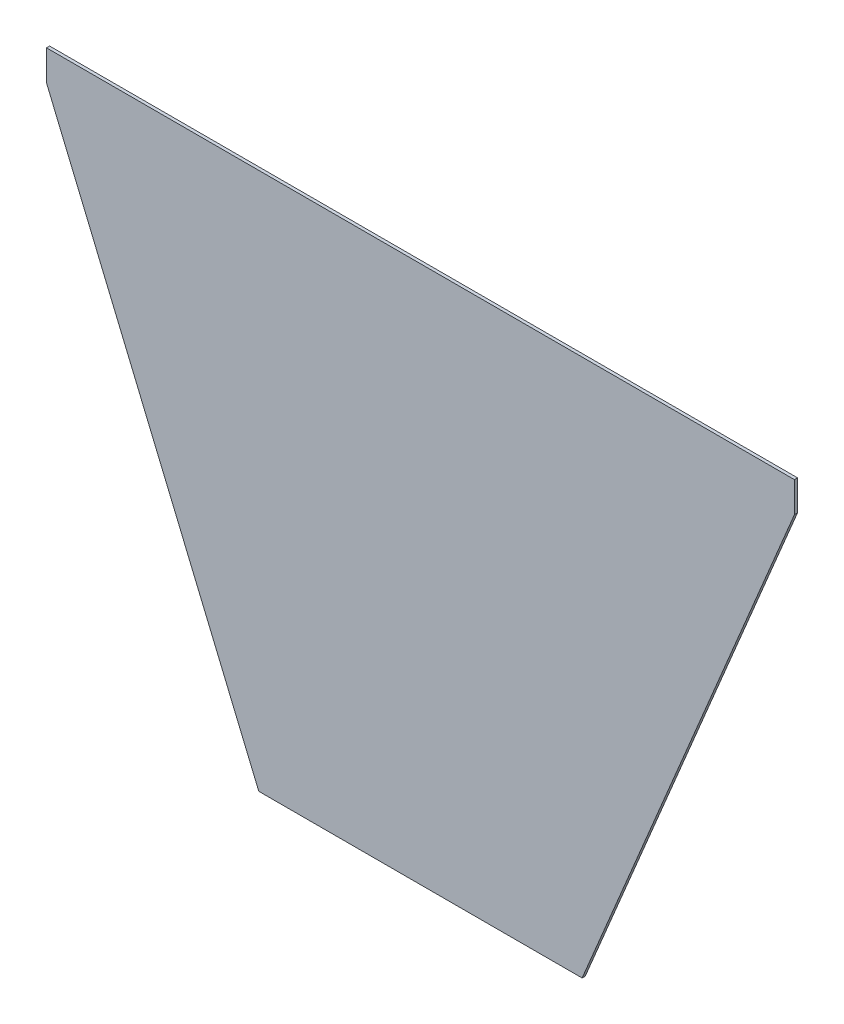
ISO-10303-21;
HEADER;
FILE_DESCRIPTION(('STEP AP214'),'2;1');
FILE_NAME('part.step','',(''),(''),'','','');
FILE_SCHEMA(('AUTOMOTIVE_DESIGN { 1 0 10303 214 1 1 1 1 }'));
ENDSEC;
DATA;
#1=APPLICATION_CONTEXT('core data for automotive mechanical design processes');
#2=APPLICATION_PROTOCOL_DEFINITION('international standard','automotive_design',2000,#1);
#3=PRODUCT_CONTEXT('',#1,'mechanical');
#4=PRODUCT('Part','Part','',(#3));
#5=PRODUCT_RELATED_PRODUCT_CATEGORY('part','',(#4));
#6=PRODUCT_DEFINITION_FORMATION('','',#4);
#7=PRODUCT_DEFINITION_CONTEXT('part definition',#1,'design');
#8=PRODUCT_DEFINITION('design','',#6,#7);
#9=PRODUCT_DEFINITION_SHAPE('','',#8);
#10=(LENGTH_UNIT() NAMED_UNIT(*) SI_UNIT(.MILLI.,.METRE.));
#11=(NAMED_UNIT(*) PLANE_ANGLE_UNIT() SI_UNIT($,.RADIAN.));
#12=(NAMED_UNIT(*) SI_UNIT($,.STERADIAN.) SOLID_ANGLE_UNIT());
#13=UNCERTAINTY_MEASURE_WITH_UNIT(LENGTH_MEASURE(1.E-05),#10,'distance_accuracy_value','');
#14=(GEOMETRIC_REPRESENTATION_CONTEXT(3) GLOBAL_UNCERTAINTY_ASSIGNED_CONTEXT((#13)) GLOBAL_UNIT_ASSIGNED_CONTEXT((#10,
#11,#12)) REPRESENTATION_CONTEXT('',''));
#15=CARTESIAN_POINT('',(0.,0.,0.));
#16=DIRECTION('',(0.,0.,1.));
#17=DIRECTION('',(1.,0.,0.));
#18=AXIS2_PLACEMENT_3D('',#15,#16,#17);
#19=CARTESIAN_POINT('',(-603.605,0.,5.));
#20=DIRECTION('',(1.,0.,0.));
#21=DIRECTION('',(0.,0.,-1.));
#22=AXIS2_PLACEMENT_3D('',#19,#20,#21);
#23=PLANE('',#22);
#24=DIRECTION('',(0.,-1.,0.));
#25=VECTOR('',#24,1.);
#26=CARTESIAN_POINT('',(-603.605,0.,0.));
#27=LINE('',#26,#25);
#28=CARTESIAN_POINT('',(-603.605,0.,0.));
#29=VERTEX_POINT('',#28);
#30=CARTESIAN_POINT('',(-603.605,-49.,0.));
#31=VERTEX_POINT('',#30);
#32=EDGE_CURVE('E122',#29,#31,#27,.T.);
#33=ORIENTED_EDGE('',*,*,#32,.T.);
#34=DIRECTION('',(0.,0.,-1.));
#35=VECTOR('',#34,1.);
#36=CARTESIAN_POINT('',(-603.605,-49.,5.));
#37=LINE('',#36,#35);
#38=CARTESIAN_POINT('',(-603.605,-49.,5.));
#39=VERTEX_POINT('',#38);
#40=EDGE_CURVE('E11',#39,#31,#37,.T.);
#41=ORIENTED_EDGE('',*,*,#40,.F.);
#42=DIRECTION('',(0.,-1.,0.));
#43=VECTOR('',#42,1.);
#44=CARTESIAN_POINT('',(-603.605,0.,5.));
#45=LINE('',#44,#43);
#46=CARTESIAN_POINT('',(-603.605,0.,5.));
#47=VERTEX_POINT('',#46);
#48=EDGE_CURVE('E132',#47,#39,#45,.T.);
#49=ORIENTED_EDGE('',*,*,#48,.F.);
#50=DIRECTION('',(0.,0.,-1.));
#51=VECTOR('',#50,1.);
#52=CARTESIAN_POINT('',(-603.605,0.,5.));
#53=LINE('',#52,#51);
#54=EDGE_CURVE('E118',#47,#29,#53,.T.);
#55=ORIENTED_EDGE('',*,*,#54,.T.);
#56=EDGE_LOOP('',(#33,#41,#49,#55));
#57=FACE_BOUND('',#56,.T.);
#58=ADVANCED_FACE('F38',(#57),#23,.F.);
#59=CARTESIAN_POINT('',(-603.605,-49.,5.));
#60=DIRECTION('',(0.922508059768131,0.385977822760373,0.));
#61=DIRECTION('',(-0.385977822760373,0.922508059768131,0.));
#62=AXIS2_PLACEMENT_3D('',#59,#60,#61);
#63=PLANE('',#62);
#64=DIRECTION('',(0.385977822760373,-0.922508059768131,0.));
#65=VECTOR('',#64,1.);
#66=CARTESIAN_POINT('',(-603.605,-49.,0.));
#67=LINE('',#66,#65);
#68=CARTESIAN_POINT('',(-260.935,-868.,0.));
#69=VERTEX_POINT('',#68);
#70=EDGE_CURVE('E125',#31,#69,#67,.T.);
#71=ORIENTED_EDGE('',*,*,#70,.T.);
#72=DIRECTION('',(0.,0.,-1.));
#73=VECTOR('',#72,1.);
#74=CARTESIAN_POINT('',(-260.935,-868.,5.));
#75=LINE('',#74,#73);
#76=CARTESIAN_POINT('',(-260.935,-868.,5.));
#77=VERTEX_POINT('',#76);
#78=EDGE_CURVE('E46',#77,#69,#75,.T.);
#79=ORIENTED_EDGE('',*,*,#78,.F.);
#80=DIRECTION('',(0.385977822760373,-0.922508059768131,0.));
#81=VECTOR('',#80,1.);
#82=CARTESIAN_POINT('',(-603.605,-49.,5.));
#83=LINE('',#82,#81);
#84=EDGE_CURVE('E91',#39,#77,#83,.T.);
#85=ORIENTED_EDGE('',*,*,#84,.F.);
#86=ORIENTED_EDGE('',*,*,#40,.T.);
#87=EDGE_LOOP('',(#71,#79,#85,#86));
#88=FACE_BOUND('',#87,.T.);
#89=ADVANCED_FACE('F156',(#88),#63,.F.);
#90=CARTESIAN_POINT('',(-260.935,-868.,5.));
#91=DIRECTION('',(0.,1.,0.));
#92=DIRECTION('',(-1.,0.,0.));
#93=AXIS2_PLACEMENT_3D('',#90,#91,#92);
#94=PLANE('',#93);
#95=DIRECTION('',(1.,0.,0.));
#96=VECTOR('',#95,1.);
#97=CARTESIAN_POINT('',(-260.935,-868.,0.));
#98=LINE('',#97,#96);
#99=CARTESIAN_POINT('',(260.935,-868.,0.));
#100=VERTEX_POINT('',#99);
#101=EDGE_CURVE('E127',#69,#100,#98,.T.);
#102=ORIENTED_EDGE('',*,*,#101,.T.);
#103=DIRECTION('',(0.,0.,-1.));
#104=VECTOR('',#103,1.);
#105=CARTESIAN_POINT('',(260.935,-868.,5.));
#106=LINE('',#105,#104);
#107=CARTESIAN_POINT('',(260.935,-868.,5.));
#108=VERTEX_POINT('',#107);
#109=EDGE_CURVE('E113',#108,#100,#106,.T.);
#110=ORIENTED_EDGE('',*,*,#109,.F.);
#111=DIRECTION('',(1.,0.,0.));
#112=VECTOR('',#111,1.);
#113=CARTESIAN_POINT('',(-260.935,-868.,5.));
#114=LINE('',#113,#112);
#115=EDGE_CURVE('E104',#77,#108,#114,.T.);
#116=ORIENTED_EDGE('',*,*,#115,.F.);
#117=ORIENTED_EDGE('',*,*,#78,.T.);
#118=EDGE_LOOP('',(#102,#110,#116,#117));
#119=FACE_BOUND('',#118,.T.);
#120=ADVANCED_FACE('F138',(#119),#94,.F.);
#121=CARTESIAN_POINT('',(603.605,-48.9999999999999,5.));
#122=DIRECTION('',(-0.922508059768131,0.385977822760373,0.));
#123=DIRECTION('',(-0.385977822760373,-0.922508059768131,0.));
#124=AXIS2_PLACEMENT_3D('',#121,#122,#123);
#125=PLANE('',#124);
#126=DIRECTION('',(0.385977822760373,0.922508059768131,0.));
#127=VECTOR('',#126,1.);
#128=CARTESIAN_POINT('',(603.605,-48.9999999999999,0.));
#129=LINE('',#128,#127);
#130=CARTESIAN_POINT('',(603.605,-48.9999999999999,0.));
#131=VERTEX_POINT('',#130);
#132=EDGE_CURVE('E112',#100,#131,#129,.T.);
#133=ORIENTED_EDGE('',*,*,#132,.T.);
#134=DIRECTION('',(0.,0.,-1.));
#135=VECTOR('',#134,1.);
#136=CARTESIAN_POINT('',(603.605,-48.9999999999999,5.));
#137=LINE('',#136,#135);
#138=CARTESIAN_POINT('',(603.605,-48.9999999999999,5.));
#139=VERTEX_POINT('',#138);
#140=EDGE_CURVE('E109',#139,#131,#137,.T.);
#141=ORIENTED_EDGE('',*,*,#140,.F.);
#142=DIRECTION('',(0.385977822760373,0.922508059768131,0.));
#143=VECTOR('',#142,1.);
#144=CARTESIAN_POINT('',(603.605,-48.9999999999999,5.));
#145=LINE('',#144,#143);
#146=EDGE_CURVE('E98',#108,#139,#145,.T.);
#147=ORIENTED_EDGE('',*,*,#146,.F.);
#148=ORIENTED_EDGE('',*,*,#109,.T.);
#149=EDGE_LOOP('',(#133,#141,#147,#148));
#150=FACE_BOUND('',#149,.T.);
#151=ADVANCED_FACE('F110',(#150),#125,.F.);
#152=CARTESIAN_POINT('',(603.605,1.47840586239868E-13,5.));
#153=DIRECTION('',(-1.,0.,0.));
#154=DIRECTION('',(0.,0.,1.));
#155=AXIS2_PLACEMENT_3D('',#152,#153,#154);
#156=PLANE('',#155);
#157=DIRECTION('',(0.,1.,0.));
#158=VECTOR('',#157,1.);
#159=CARTESIAN_POINT('',(603.605,1.47840586239868E-13,0.));
#160=LINE('',#159,#158);
#161=CARTESIAN_POINT('',(603.605,1.47840586239868E-13,0.));
#162=VERTEX_POINT('',#161);
#163=EDGE_CURVE('E77',#131,#162,#160,.T.);
#164=ORIENTED_EDGE('',*,*,#163,.T.);
#165=DIRECTION('',(0.,0.,-1.));
#166=VECTOR('',#165,1.);
#167=CARTESIAN_POINT('',(603.605,1.47840586239868E-13,5.));
#168=LINE('',#167,#166);
#169=CARTESIAN_POINT('',(603.605,1.47840586239868E-13,5.));
#170=VERTEX_POINT('',#169);
#171=EDGE_CURVE('E114',#170,#162,#168,.T.);
#172=ORIENTED_EDGE('',*,*,#171,.F.);
#173=DIRECTION('',(0.,1.,0.));
#174=VECTOR('',#173,1.);
#175=CARTESIAN_POINT('',(603.605,1.47840586239868E-13,5.));
#176=LINE('',#175,#174);
#177=EDGE_CURVE('E102',#139,#170,#176,.T.);
#178=ORIENTED_EDGE('',*,*,#177,.F.);
#179=ORIENTED_EDGE('',*,*,#140,.T.);
#180=EDGE_LOOP('',(#164,#172,#178,#179));
#181=FACE_BOUND('',#180,.T.);
#182=ADVANCED_FACE('F116',(#181),#156,.F.);
#183=CARTESIAN_POINT('',(-603.605,0.,5.));
#184=DIRECTION('',(0.,-1.,0.));
#185=DIRECTION('',(1.,0.,0.));
#186=AXIS2_PLACEMENT_3D('',#183,#184,#185);
#187=PLANE('',#186);
#188=DIRECTION('',(-1.,0.,0.));
#189=VECTOR('',#188,1.);
#190=CARTESIAN_POINT('',(-603.605,0.,0.));
#191=LINE('',#190,#189);
#192=EDGE_CURVE('E83',#162,#29,#191,.T.);
#193=ORIENTED_EDGE('',*,*,#192,.T.);
#194=ORIENTED_EDGE('',*,*,#54,.F.);
#195=DIRECTION('',(-1.,0.,0.));
#196=VECTOR('',#195,1.);
#197=CARTESIAN_POINT('',(-603.605,0.,5.));
#198=LINE('',#197,#196);
#199=EDGE_CURVE('E54',#170,#47,#198,.T.);
#200=ORIENTED_EDGE('',*,*,#199,.F.);
#201=ORIENTED_EDGE('',*,*,#171,.T.);
#202=EDGE_LOOP('',(#193,#194,#200,#201));
#203=FACE_BOUND('',#202,.T.);
#204=ADVANCED_FACE('F145',(#203),#187,.F.);
#205=CARTESIAN_POINT('',(-603.605,-868.,5.));
#206=DIRECTION('',(0.,0.,1.));
#207=DIRECTION('',(1.,0.,0.));
#208=AXIS2_PLACEMENT_3D('',#205,#206,#207);
#209=PLANE('',#208);
#210=ORIENTED_EDGE('',*,*,#48,.T.);
#211=ORIENTED_EDGE('',*,*,#84,.T.);
#212=ORIENTED_EDGE('',*,*,#115,.T.);
#213=ORIENTED_EDGE('',*,*,#146,.T.);
#214=ORIENTED_EDGE('',*,*,#177,.T.);
#215=ORIENTED_EDGE('',*,*,#199,.T.);
#216=EDGE_LOOP('',(#210,#211,#212,#213,#214,#215));
#217=FACE_BOUND('',#216,.T.);
#218=ADVANCED_FACE('F100',(#217),#209,.T.);
#219=CARTESIAN_POINT('',(-603.605,-868.,0.));
#220=DIRECTION('',(0.,0.,1.));
#221=DIRECTION('',(1.,0.,0.));
#222=AXIS2_PLACEMENT_3D('',#219,#220,#221);
#223=PLANE('',#222);
#224=ORIENTED_EDGE('',*,*,#32,.F.);
#225=ORIENTED_EDGE('',*,*,#192,.F.);
#226=ORIENTED_EDGE('',*,*,#163,.F.);
#227=ORIENTED_EDGE('',*,*,#132,.F.);
#228=ORIENTED_EDGE('',*,*,#101,.F.);
#229=ORIENTED_EDGE('',*,*,#70,.F.);
#230=EDGE_LOOP('',(#224,#225,#226,#227,#228,#229));
#231=FACE_BOUND('',#230,.T.);
#232=ADVANCED_FACE('F141',(#231),#223,.F.);
#233=CLOSED_SHELL('',(#58,#89,#120,#151,#182,#204,#218,#232));
#234=MANIFOLD_SOLID_BREP('B2',#233);
#235=ADVANCED_BREP_SHAPE_REPRESENTATION('',(#18,#234),#14);
#236=SHAPE_DEFINITION_REPRESENTATION(#9,#235);
ENDSEC;
END-ISO-10303-21;
